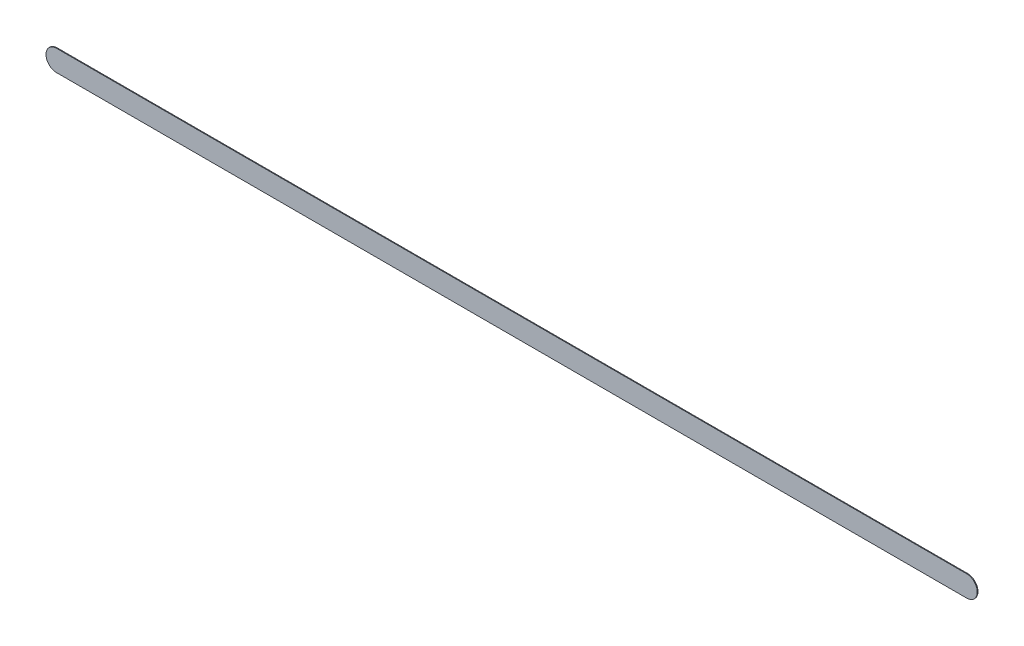
ISO-10303-21;
HEADER;
FILE_DESCRIPTION(('STEP AP214'),'2;1');
FILE_NAME('part.step','',(''),(''),'','','');
FILE_SCHEMA(('AUTOMOTIVE_DESIGN { 1 0 10303 214 1 1 1 1 }'));
ENDSEC;
DATA;
#1=APPLICATION_CONTEXT('core data for automotive mechanical design processes');
#2=APPLICATION_PROTOCOL_DEFINITION('international standard','automotive_design',2000,#1);
#3=PRODUCT_CONTEXT('',#1,'mechanical');
#4=PRODUCT('Part','Part','',(#3));
#5=PRODUCT_RELATED_PRODUCT_CATEGORY('part','',(#4));
#6=PRODUCT_DEFINITION_FORMATION('','',#4);
#7=PRODUCT_DEFINITION_CONTEXT('part definition',#1,'design');
#8=PRODUCT_DEFINITION('design','',#6,#7);
#9=PRODUCT_DEFINITION_SHAPE('','',#8);
#10=(LENGTH_UNIT() NAMED_UNIT(*) SI_UNIT(.MILLI.,.METRE.));
#11=(NAMED_UNIT(*) PLANE_ANGLE_UNIT() SI_UNIT($,.RADIAN.));
#12=(NAMED_UNIT(*) SI_UNIT($,.STERADIAN.) SOLID_ANGLE_UNIT());
#13=UNCERTAINTY_MEASURE_WITH_UNIT(LENGTH_MEASURE(1.E-05),#10,'distance_accuracy_value','');
#14=(GEOMETRIC_REPRESENTATION_CONTEXT(3) GLOBAL_UNCERTAINTY_ASSIGNED_CONTEXT((#13)) GLOBAL_UNIT_ASSIGNED_CONTEXT((#10,
#11,#12)) REPRESENTATION_CONTEXT('',''));
#15=CARTESIAN_POINT('',(0.,0.,0.));
#16=DIRECTION('',(0.,0.,1.));
#17=DIRECTION('',(1.,0.,0.));
#18=AXIS2_PLACEMENT_3D('',#15,#16,#17);
#19=CARTESIAN_POINT('',(53.1021036,118.9791118,0.));
#20=DIRECTION('',(0.,1.,0.));
#21=DIRECTION('',(1.,0.,0.));
#22=AXIS2_PLACEMENT_3D('',#19,#20,#21);
#23=PLANE('',#22);
#24=DIRECTION('',(1.,0.,0.));
#25=VECTOR('',#24,1.);
#26=CARTESIAN_POINT('',(53.1021036,118.9791118,0.03556));
#27=LINE('',#26,#25);
#28=CARTESIAN_POINT('',(53.1021036,118.9791118,0.03556));
#29=VERTEX_POINT('',#28);
#30=CARTESIAN_POINT('',(96.2821036,118.9791118,0.03556));
#31=VERTEX_POINT('',#30);
#32=EDGE_CURVE('E11',#29,#31,#27,.T.);
#33=ORIENTED_EDGE('',*,*,#32,.F.);
#34=DIRECTION('',(0.,0.,1.));
#35=VECTOR('',#34,1.);
#36=CARTESIAN_POINT('',(53.1021036,118.9791118,0.));
#37=LINE('',#36,#35);
#38=CARTESIAN_POINT('',(53.1021036,118.9791118,0.));
#39=VERTEX_POINT('',#38);
#40=EDGE_CURVE('E24',#39,#29,#37,.T.);
#41=ORIENTED_EDGE('',*,*,#40,.F.);
#42=DIRECTION('',(1.,0.,0.));
#43=VECTOR('',#42,1.);
#44=CARTESIAN_POINT('',(53.1021036,118.9791118,0.));
#45=LINE('',#44,#43);
#46=CARTESIAN_POINT('',(96.2821036,118.9791118,0.));
#47=VERTEX_POINT('',#46);
#48=EDGE_CURVE('E75',#39,#47,#45,.T.);
#49=ORIENTED_EDGE('',*,*,#48,.T.);
#50=DIRECTION('',(0.,0.,1.));
#51=VECTOR('',#50,1.);
#52=CARTESIAN_POINT('',(96.2821036,118.9791118,0.));
#53=LINE('',#52,#51);
#54=EDGE_CURVE('E37',#47,#31,#53,.T.);
#55=ORIENTED_EDGE('',*,*,#54,.T.);
#56=EDGE_LOOP('',(#33,#41,#49,#55));
#57=FACE_BOUND('',#56,.T.);
#58=ADVANCED_FACE('F17',(#57),#23,.F.);
#59=CARTESIAN_POINT('',(96.2821036,119.4791108,0.));
#60=DIRECTION('',(0.,0.,-1.));
#61=DIRECTION('',(0.,-1.,0.));
#62=AXIS2_PLACEMENT_3D('',#59,#60,#61);
#63=CYLINDRICAL_SURFACE('',#62,0.499999000000002);
#64=CARTESIAN_POINT('',(96.2821036,119.4791108,0.03556));
#65=DIRECTION('',(0.,0.,1.));
#66=DIRECTION('',(0.,-1.,0.));
#67=AXIS2_PLACEMENT_3D('',#64,#65,#66);
#68=CIRCLE('',#67,0.499999000000002);
#69=CARTESIAN_POINT('',(96.2821036,119.9791098,0.03556));
#70=VERTEX_POINT('',#69);
#71=EDGE_CURVE('E83',#31,#70,#68,.T.);
#72=ORIENTED_EDGE('',*,*,#71,.F.);
#73=ORIENTED_EDGE('',*,*,#54,.F.);
#74=CARTESIAN_POINT('',(96.2821036,119.4791108,0.));
#75=DIRECTION('',(0.,0.,1.));
#76=DIRECTION('',(0.,-1.,0.));
#77=AXIS2_PLACEMENT_3D('',#74,#75,#76);
#78=CIRCLE('',#77,0.499999000000002);
#79=CARTESIAN_POINT('',(96.2821036,119.9791098,0.));
#80=VERTEX_POINT('',#79);
#81=EDGE_CURVE('E81',#47,#80,#78,.T.);
#82=ORIENTED_EDGE('',*,*,#81,.T.);
#83=DIRECTION('',(0.,0.,1.));
#84=VECTOR('',#83,1.);
#85=CARTESIAN_POINT('',(96.2821036,119.9791098,0.));
#86=LINE('',#85,#84);
#87=EDGE_CURVE('E67',#80,#70,#86,.T.);
#88=ORIENTED_EDGE('',*,*,#87,.T.);
#89=EDGE_LOOP('',(#72,#73,#82,#88));
#90=FACE_BOUND('',#89,.T.);
#91=ADVANCED_FACE('F89',(#90),#63,.T.);
#92=CARTESIAN_POINT('',(96.2821036,119.9791098,0.));
#93=DIRECTION('',(0.,-1.,0.));
#94=DIRECTION('',(-1.,0.,0.));
#95=AXIS2_PLACEMENT_3D('',#92,#93,#94);
#96=PLANE('',#95);
#97=DIRECTION('',(-1.,0.,0.));
#98=VECTOR('',#97,1.);
#99=CARTESIAN_POINT('',(96.2821036,119.9791098,0.03556));
#100=LINE('',#99,#98);
#101=CARTESIAN_POINT('',(53.1021036,119.9791098,0.03556));
#102=VERTEX_POINT('',#101);
#103=EDGE_CURVE('E71',#70,#102,#100,.T.);
#104=ORIENTED_EDGE('',*,*,#103,.F.);
#105=ORIENTED_EDGE('',*,*,#87,.F.);
#106=DIRECTION('',(-1.,0.,0.));
#107=VECTOR('',#106,1.);
#108=CARTESIAN_POINT('',(96.2821036,119.9791098,0.));
#109=LINE('',#108,#107);
#110=CARTESIAN_POINT('',(53.1021036,119.9791098,0.));
#111=VERTEX_POINT('',#110);
#112=EDGE_CURVE('E63',#80,#111,#109,.T.);
#113=ORIENTED_EDGE('',*,*,#112,.T.);
#114=DIRECTION('',(0.,0.,1.));
#115=VECTOR('',#114,1.);
#116=CARTESIAN_POINT('',(53.1021036,119.9791098,0.));
#117=LINE('',#116,#115);
#118=EDGE_CURVE('E53',#111,#102,#117,.T.);
#119=ORIENTED_EDGE('',*,*,#118,.T.);
#120=EDGE_LOOP('',(#104,#105,#113,#119));
#121=FACE_BOUND('',#120,.T.);
#122=ADVANCED_FACE('F66',(#121),#96,.F.);
#123=CARTESIAN_POINT('',(53.1021036,119.4791108,0.));
#124=DIRECTION('',(0.,0.,-1.));
#125=DIRECTION('',(0.,1.,0.));
#126=AXIS2_PLACEMENT_3D('',#123,#124,#125);
#127=CYLINDRICAL_SURFACE('',#126,0.499999000000002);
#128=CARTESIAN_POINT('',(53.1021036,119.4791108,0.03556));
#129=DIRECTION('',(0.,0.,1.));
#130=DIRECTION('',(0.,1.,0.));
#131=AXIS2_PLACEMENT_3D('',#128,#129,#130);
#132=CIRCLE('',#131,0.499999000000002);
#133=EDGE_CURVE('E59',#102,#29,#132,.T.);
#134=ORIENTED_EDGE('',*,*,#133,.F.);
#135=ORIENTED_EDGE('',*,*,#118,.F.);
#136=CARTESIAN_POINT('',(53.1021036,119.4791108,0.));
#137=DIRECTION('',(0.,0.,1.));
#138=DIRECTION('',(0.,1.,0.));
#139=AXIS2_PLACEMENT_3D('',#136,#137,#138);
#140=CIRCLE('',#139,0.499999000000002);
#141=EDGE_CURVE('E57',#111,#39,#140,.T.);
#142=ORIENTED_EDGE('',*,*,#141,.T.);
#143=ORIENTED_EDGE('',*,*,#40,.T.);
#144=EDGE_LOOP('',(#134,#135,#142,#143));
#145=FACE_BOUND('',#144,.T.);
#146=ADVANCED_FACE('F55',(#145),#127,.T.);
#147=CARTESIAN_POINT('',(53.1021036,118.9791118,0.));
#148=DIRECTION('',(0.,0.,-1.));
#149=DIRECTION('',(-1.,0.,0.));
#150=AXIS2_PLACEMENT_3D('',#147,#148,#149);
#151=PLANE('',#150);
#152=ORIENTED_EDGE('',*,*,#141,.F.);
#153=ORIENTED_EDGE('',*,*,#112,.F.);
#154=ORIENTED_EDGE('',*,*,#81,.F.);
#155=ORIENTED_EDGE('',*,*,#48,.F.);
#156=EDGE_LOOP('',(#152,#153,#154,#155));
#157=FACE_BOUND('',#156,.T.);
#158=ADVANCED_FACE('F74',(#157),#151,.T.);
#159=CARTESIAN_POINT('',(53.1021036,118.9791118,0.03556));
#160=DIRECTION('',(0.,0.,-1.));
#161=DIRECTION('',(-1.,0.,0.));
#162=AXIS2_PLACEMENT_3D('',#159,#160,#161);
#163=PLANE('',#162);
#164=ORIENTED_EDGE('',*,*,#32,.T.);
#165=ORIENTED_EDGE('',*,*,#71,.T.);
#166=ORIENTED_EDGE('',*,*,#103,.T.);
#167=ORIENTED_EDGE('',*,*,#133,.T.);
#168=EDGE_LOOP('',(#164,#165,#166,#167));
#169=FACE_BOUND('',#168,.T.);
#170=ADVANCED_FACE('F91',(#169),#163,.F.);
#171=CLOSED_SHELL('',(#58,#91,#122,#146,#158,#170));
#172=MANIFOLD_SOLID_BREP('B1',#171);
#173=ADVANCED_BREP_SHAPE_REPRESENTATION('',(#18,#172),#14);
#174=SHAPE_DEFINITION_REPRESENTATION(#9,#173);
ENDSEC;
END-ISO-10303-21;
